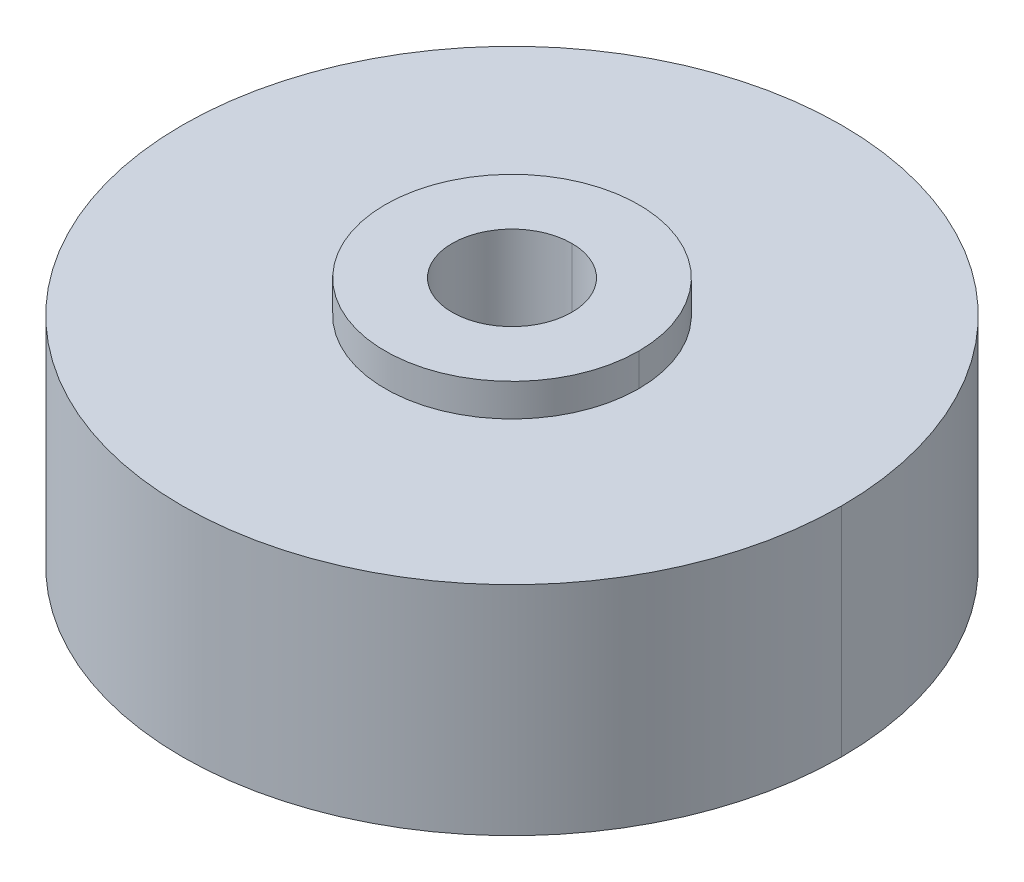
ISO-10303-21;
HEADER;
FILE_DESCRIPTION(('STEP AP214'),'2;1');
FILE_NAME('part.step','',(''),(''),'','','');
FILE_SCHEMA(('AUTOMOTIVE_DESIGN { 1 0 10303 214 1 1 1 1 }'));
ENDSEC;
DATA;
#1=APPLICATION_CONTEXT('core data for automotive mechanical design processes');
#2=APPLICATION_PROTOCOL_DEFINITION('international standard','automotive_design',2000,#1);
#3=PRODUCT_CONTEXT('',#1,'mechanical');
#4=PRODUCT('Part','Part','',(#3));
#5=PRODUCT_RELATED_PRODUCT_CATEGORY('part','',(#4));
#6=PRODUCT_DEFINITION_FORMATION('','',#4);
#7=PRODUCT_DEFINITION_CONTEXT('part definition',#1,'design');
#8=PRODUCT_DEFINITION('design','',#6,#7);
#9=PRODUCT_DEFINITION_SHAPE('','',#8);
#10=(LENGTH_UNIT() NAMED_UNIT(*) SI_UNIT(.MILLI.,.METRE.));
#11=(NAMED_UNIT(*) PLANE_ANGLE_UNIT() SI_UNIT($,.RADIAN.));
#12=(NAMED_UNIT(*) SI_UNIT($,.STERADIAN.) SOLID_ANGLE_UNIT());
#13=UNCERTAINTY_MEASURE_WITH_UNIT(LENGTH_MEASURE(1.E-05),#10,'distance_accuracy_value','');
#14=(GEOMETRIC_REPRESENTATION_CONTEXT(3) GLOBAL_UNCERTAINTY_ASSIGNED_CONTEXT((#13)) GLOBAL_UNIT_ASSIGNED_CONTEXT((#10,
#11,#12)) REPRESENTATION_CONTEXT('',''));
#15=CARTESIAN_POINT('',(0.,0.,0.));
#16=DIRECTION('',(0.,0.,1.));
#17=DIRECTION('',(1.,0.,0.));
#18=AXIS2_PLACEMENT_3D('',#15,#16,#17);
#19=CARTESIAN_POINT('',(0.,3.,0.));
#20=DIRECTION('',(0.,-1.,0.));
#21=DIRECTION('',(1.,0.,0.));
#22=AXIS2_PLACEMENT_3D('',#19,#20,#21);
#23=CYLINDRICAL_SURFACE('',#22,6.5);
#24=CARTESIAN_POINT('',(0.,3.,0.));
#25=DIRECTION('',(0.,-1.,0.));
#26=DIRECTION('',(1.,0.,0.));
#27=AXIS2_PLACEMENT_3D('',#24,#25,#26);
#28=CIRCLE('',#27,6.5);
#29=CARTESIAN_POINT('',(6.5,3.,0.));
#30=VERTEX_POINT('',#29);
#31=CARTESIAN_POINT('',(-6.5,3.,0.));
#32=VERTEX_POINT('',#31);
#33=EDGE_CURVE('E11',#30,#32,#28,.T.);
#34=ORIENTED_EDGE('',*,*,#33,.T.);
#35=DIRECTION('',(0.,-1.,0.));
#36=VECTOR('',#35,1.);
#37=CARTESIAN_POINT('',(-6.5,3.,0.));
#38=LINE('',#37,#36);
#39=CARTESIAN_POINT('',(-6.5,0.,0.));
#40=VERTEX_POINT('',#39);
#41=EDGE_CURVE('E28',#32,#40,#38,.T.);
#42=ORIENTED_EDGE('',*,*,#41,.T.);
#43=CARTESIAN_POINT('',(0.,0.,0.));
#44=DIRECTION('',(0.,-1.,0.));
#45=DIRECTION('',(1.,0.,0.));
#46=AXIS2_PLACEMENT_3D('',#43,#44,#45);
#47=CIRCLE('',#46,6.5);
#48=CARTESIAN_POINT('',(6.5,0.,0.));
#49=VERTEX_POINT('',#48);
#50=EDGE_CURVE('E230',#49,#40,#47,.T.);
#51=ORIENTED_EDGE('',*,*,#50,.F.);
#52=DIRECTION('',(0.,-1.,0.));
#53=VECTOR('',#52,1.);
#54=CARTESIAN_POINT('',(6.5,3.,0.));
#55=LINE('',#54,#53);
#56=EDGE_CURVE('E241',#30,#49,#55,.T.);
#57=ORIENTED_EDGE('',*,*,#56,.F.);
#58=EDGE_LOOP('',(#34,#42,#51,#57));
#59=FACE_BOUND('',#58,.T.);
#60=ADVANCED_FACE('F17',(#59),#23,.T.);
#61=CARTESIAN_POINT('',(0.,3.,0.));
#62=DIRECTION('',(0.,-1.,0.));
#63=DIRECTION('',(1.,0.,0.));
#64=AXIS2_PLACEMENT_3D('',#61,#62,#63);
#65=CYLINDRICAL_SURFACE('',#64,7.);
#66=CARTESIAN_POINT('',(0.,3.,0.));
#67=DIRECTION('',(0.,-1.,0.));
#68=DIRECTION('',(1.,0.,0.));
#69=AXIS2_PLACEMENT_3D('',#66,#67,#68);
#70=CIRCLE('',#69,7.);
#71=CARTESIAN_POINT('',(-7.,3.,0.));
#72=VERTEX_POINT('',#71);
#73=CARTESIAN_POINT('',(7.,3.,0.));
#74=VERTEX_POINT('',#73);
#75=EDGE_CURVE('E151',#72,#74,#70,.T.);
#76=ORIENTED_EDGE('',*,*,#75,.F.);
#77=DIRECTION('',(0.,-1.,0.));
#78=VECTOR('',#77,1.);
#79=CARTESIAN_POINT('',(-7.,3.,0.));
#80=LINE('',#79,#78);
#81=CARTESIAN_POINT('',(-7.,0.,0.));
#82=VERTEX_POINT('',#81);
#83=EDGE_CURVE('E138',#72,#82,#80,.T.);
#84=ORIENTED_EDGE('',*,*,#83,.T.);
#85=CARTESIAN_POINT('',(0.,0.,0.));
#86=DIRECTION('',(0.,-1.,0.));
#87=DIRECTION('',(1.,0.,0.));
#88=AXIS2_PLACEMENT_3D('',#85,#86,#87);
#89=CIRCLE('',#88,7.);
#90=CARTESIAN_POINT('',(7.,0.,0.));
#91=VERTEX_POINT('',#90);
#92=EDGE_CURVE('E136',#82,#91,#89,.T.);
#93=ORIENTED_EDGE('',*,*,#92,.T.);
#94=DIRECTION('',(0.,-1.,0.));
#95=VECTOR('',#94,1.);
#96=CARTESIAN_POINT('',(7.,3.,0.));
#97=LINE('',#96,#95);
#98=EDGE_CURVE('E123',#74,#91,#97,.T.);
#99=ORIENTED_EDGE('',*,*,#98,.F.);
#100=EDGE_LOOP('',(#76,#84,#93,#99));
#101=FACE_BOUND('',#100,.T.);
#102=ADVANCED_FACE('F137',(#101),#65,.F.);
#103=CARTESIAN_POINT('',(0.,6.9,0.));
#104=DIRECTION('',(0.,1.,0.));
#105=DIRECTION('',(0.,0.,1.));
#106=AXIS2_PLACEMENT_3D('',#103,#104,#105);
#107=CYLINDRICAL_SURFACE('',#106,1.65);
#108=CARTESIAN_POINT('',(0.,2.9,0.));
#109=DIRECTION('',(0.,1.,0.));
#110=DIRECTION('',(0.,0.,1.));
#111=AXIS2_PLACEMENT_3D('',#108,#109,#110);
#112=CIRCLE('',#111,1.65);
#113=CARTESIAN_POINT('',(0.,2.9,-1.65));
#114=VERTEX_POINT('',#113);
#115=CARTESIAN_POINT('',(0.,2.9,1.65));
#116=VERTEX_POINT('',#115);
#117=EDGE_CURVE('E157',#114,#116,#112,.T.);
#118=ORIENTED_EDGE('',*,*,#117,.F.);
#119=DIRECTION('',(0.,1.,0.));
#120=VECTOR('',#119,1.);
#121=CARTESIAN_POINT('',(0.,6.9,-1.65));
#122=LINE('',#121,#120);
#123=CARTESIAN_POINT('',(0.,6.9,-1.65));
#124=VERTEX_POINT('',#123);
#125=EDGE_CURVE('E141',#114,#124,#122,.T.);
#126=ORIENTED_EDGE('',*,*,#125,.T.);
#127=CARTESIAN_POINT('',(0.,6.9,0.));
#128=DIRECTION('',(0.,1.,0.));
#129=DIRECTION('',(0.,0.,1.));
#130=AXIS2_PLACEMENT_3D('',#127,#128,#129);
#131=CIRCLE('',#130,1.65);
#132=CARTESIAN_POINT('',(0.,6.9,1.65));
#133=VERTEX_POINT('',#132);
#134=EDGE_CURVE('E219',#124,#133,#131,.T.);
#135=ORIENTED_EDGE('',*,*,#134,.T.);
#136=DIRECTION('',(0.,1.,0.));
#137=VECTOR('',#136,1.);
#138=CARTESIAN_POINT('',(0.,6.9,1.65));
#139=LINE('',#138,#137);
#140=EDGE_CURVE('E163',#116,#133,#139,.T.);
#141=ORIENTED_EDGE('',*,*,#140,.F.);
#142=EDGE_LOOP('',(#118,#126,#135,#141));
#143=FACE_BOUND('',#142,.T.);
#144=ADVANCED_FACE('F281',(#143),#107,.F.);
#145=CARTESIAN_POINT('',(0.,2.9,0.));
#146=DIRECTION('',(0.,1.,0.));
#147=DIRECTION('',(0.,0.,1.));
#148=AXIS2_PLACEMENT_3D('',#145,#146,#147);
#149=CONICAL_SURFACE('',#148,1.65,1.02974425867665);
#150=DIRECTION('',(0.,0.515038074910055,0.857167300702112));
#151=VECTOR('',#150,1.);
#152=CARTESIAN_POINT('',(0.,2.9,1.65));
#153=LINE('',#152,#151);
#154=CARTESIAN_POINT('',(0.,1.90857997860452,0.));
#155=VERTEX_POINT('',#154);
#156=EDGE_CURVE('E184',#155,#116,#153,.T.);
#157=ORIENTED_EDGE('',*,*,#156,.F.);
#158=DIRECTION('',(0.,0.515038074910055,-0.857167300702112));
#159=VECTOR('',#158,1.);
#160=CARTESIAN_POINT('',(0.,2.9,-1.65));
#161=LINE('',#160,#159);
#162=EDGE_CURVE('E161',#155,#114,#161,.T.);
#163=ORIENTED_EDGE('',*,*,#162,.T.);
#164=ORIENTED_EDGE('',*,*,#117,.T.);
#165=EDGE_LOOP('',(#157,#163,#164));
#166=FACE_BOUND('',#165,.T.);
#167=ADVANCED_FACE('F289',(#166),#149,.F.);
#168=CARTESIAN_POINT('',(0.,6.9,0.));
#169=DIRECTION('',(0.,1.,0.));
#170=DIRECTION('',(-1.,0.,0.));
#171=AXIS2_PLACEMENT_3D('',#168,#169,#170);
#172=CYLINDRICAL_SURFACE('',#171,3.5);
#173=CARTESIAN_POINT('',(0.,6.,0.));
#174=DIRECTION('',(0.,1.,0.));
#175=DIRECTION('',(-1.,0.,0.));
#176=AXIS2_PLACEMENT_3D('',#173,#174,#175);
#177=CIRCLE('',#176,3.5);
#178=CARTESIAN_POINT('',(-3.5,6.,0.));
#179=VERTEX_POINT('',#178);
#180=CARTESIAN_POINT('',(3.5,6.,0.));
#181=VERTEX_POINT('',#180);
#182=EDGE_CURVE('E162',#179,#181,#177,.T.);
#183=ORIENTED_EDGE('',*,*,#182,.T.);
#184=DIRECTION('',(0.,1.,0.));
#185=VECTOR('',#184,1.);
#186=CARTESIAN_POINT('',(3.5,6.9,0.));
#187=LINE('',#186,#185);
#188=CARTESIAN_POINT('',(3.5,6.9,0.));
#189=VERTEX_POINT('',#188);
#190=EDGE_CURVE('E216',#181,#189,#187,.T.);
#191=ORIENTED_EDGE('',*,*,#190,.T.);
#192=CARTESIAN_POINT('',(0.,6.9,0.));
#193=DIRECTION('',(0.,1.,0.));
#194=DIRECTION('',(-1.,0.,0.));
#195=AXIS2_PLACEMENT_3D('',#192,#193,#194);
#196=CIRCLE('',#195,3.5);
#197=CARTESIAN_POINT('',(-3.5,6.9,0.));
#198=VERTEX_POINT('',#197);
#199=EDGE_CURVE('E155',#198,#189,#196,.T.);
#200=ORIENTED_EDGE('',*,*,#199,.F.);
#201=DIRECTION('',(0.,1.,0.));
#202=VECTOR('',#201,1.);
#203=CARTESIAN_POINT('',(-3.5,6.9,0.));
#204=LINE('',#203,#202);
#205=EDGE_CURVE('E166',#179,#198,#204,.T.);
#206=ORIENTED_EDGE('',*,*,#205,.F.);
#207=EDGE_LOOP('',(#183,#191,#200,#206));
#208=FACE_BOUND('',#207,.T.);
#209=ADVANCED_FACE('F291',(#208),#172,.T.);
#210=CARTESIAN_POINT('',(0.,6.9,0.));
#211=DIRECTION('',(0.,1.,0.));
#212=DIRECTION('',(-1.,0.,0.));
#213=AXIS2_PLACEMENT_3D('',#210,#211,#212);
#214=CYLINDRICAL_SURFACE('',#213,9.1);
#215=CARTESIAN_POINT('',(0.,0.,0.));
#216=DIRECTION('',(0.,1.,0.));
#217=DIRECTION('',(-1.,0.,0.));
#218=AXIS2_PLACEMENT_3D('',#215,#216,#217);
#219=CIRCLE('',#218,9.1);
#220=CARTESIAN_POINT('',(-9.1,0.,0.));
#221=VERTEX_POINT('',#220);
#222=CARTESIAN_POINT('',(9.1,0.,0.));
#223=VERTEX_POINT('',#222);
#224=EDGE_CURVE('E212',#221,#223,#219,.T.);
#225=ORIENTED_EDGE('',*,*,#224,.T.);
#226=DIRECTION('',(0.,1.,0.));
#227=VECTOR('',#226,1.);
#228=CARTESIAN_POINT('',(9.1,6.9,0.));
#229=LINE('',#228,#227);
#230=CARTESIAN_POINT('',(9.1,6.,0.));
#231=VERTEX_POINT('',#230);
#232=EDGE_CURVE('E211',#223,#231,#229,.T.);
#233=ORIENTED_EDGE('',*,*,#232,.T.);
#234=CARTESIAN_POINT('',(0.,6.,0.));
#235=DIRECTION('',(0.,1.,0.));
#236=DIRECTION('',(-1.,0.,0.));
#237=AXIS2_PLACEMENT_3D('',#234,#235,#236);
#238=CIRCLE('',#237,9.1);
#239=CARTESIAN_POINT('',(-9.1,6.,0.));
#240=VERTEX_POINT('',#239);
#241=EDGE_CURVE('E207',#240,#231,#238,.T.);
#242=ORIENTED_EDGE('',*,*,#241,.F.);
#243=DIRECTION('',(0.,1.,0.));
#244=VECTOR('',#243,1.);
#245=CARTESIAN_POINT('',(-9.1,6.9,0.));
#246=LINE('',#245,#244);
#247=EDGE_CURVE('E203',#221,#240,#246,.T.);
#248=ORIENTED_EDGE('',*,*,#247,.F.);
#249=EDGE_LOOP('',(#225,#233,#242,#248));
#250=FACE_BOUND('',#249,.T.);
#251=ADVANCED_FACE('F261',(#250),#214,.T.);
#252=CARTESIAN_POINT('',(0.,0.,0.));
#253=DIRECTION('',(0.,1.,0.));
#254=DIRECTION('',(1.,0.,0.));
#255=AXIS2_PLACEMENT_3D('',#252,#253,#254);
#256=PLANE('',#255);
#257=ORIENTED_EDGE('',*,*,#224,.F.);
#258=CARTESIAN_POINT('',(0.,0.,0.));
#259=DIRECTION('',(0.,1.,0.));
#260=DIRECTION('',(-1.,0.,0.));
#261=AXIS2_PLACEMENT_3D('',#258,#259,#260);
#262=CIRCLE('',#261,9.1);
#263=EDGE_CURVE('E206',#223,#221,#262,.T.);
#264=ORIENTED_EDGE('',*,*,#263,.F.);
#265=EDGE_LOOP('',(#257,#264));
#266=FACE_BOUND('',#265,.T.);
#267=CARTESIAN_POINT('',(0.,0.,0.));
#268=DIRECTION('',(0.,-1.,0.));
#269=DIRECTION('',(1.,0.,0.));
#270=AXIS2_PLACEMENT_3D('',#267,#268,#269);
#271=CIRCLE('',#270,7.);
#272=EDGE_CURVE('E128',#91,#82,#271,.T.);
#273=ORIENTED_EDGE('',*,*,#272,.F.);
#274=ORIENTED_EDGE('',*,*,#92,.F.);
#275=EDGE_LOOP('',(#273,#274));
#276=FACE_BOUND('',#275,.T.);
#277=ADVANCED_FACE('F143',(#266,#276),#256,.F.);
#278=CARTESIAN_POINT('',(0.,6.9,0.));
#279=DIRECTION('',(0.,1.,0.));
#280=DIRECTION('',(-1.,0.,0.));
#281=AXIS2_PLACEMENT_3D('',#278,#279,#280);
#282=CYLINDRICAL_SURFACE('',#281,9.1);
#283=ORIENTED_EDGE('',*,*,#232,.F.);
#284=ORIENTED_EDGE('',*,*,#263,.T.);
#285=ORIENTED_EDGE('',*,*,#247,.T.);
#286=CARTESIAN_POINT('',(0.,6.,0.));
#287=DIRECTION('',(0.,1.,0.));
#288=DIRECTION('',(-1.,0.,0.));
#289=AXIS2_PLACEMENT_3D('',#286,#287,#288);
#290=CIRCLE('',#289,9.1);
#291=EDGE_CURVE('E178',#231,#240,#290,.T.);
#292=ORIENTED_EDGE('',*,*,#291,.F.);
#293=EDGE_LOOP('',(#283,#284,#285,#292));
#294=FACE_BOUND('',#293,.T.);
#295=ADVANCED_FACE('F266',(#294),#282,.T.);
#296=CARTESIAN_POINT('',(9.1,6.,0.));
#297=DIRECTION('',(0.,-1.,0.));
#298=DIRECTION('',(0.,0.,-1.));
#299=AXIS2_PLACEMENT_3D('',#296,#297,#298);
#300=PLANE('',#299);
#301=ORIENTED_EDGE('',*,*,#241,.T.);
#302=ORIENTED_EDGE('',*,*,#291,.T.);
#303=EDGE_LOOP('',(#301,#302));
#304=FACE_BOUND('',#303,.T.);
#305=ORIENTED_EDGE('',*,*,#182,.F.);
#306=CARTESIAN_POINT('',(0.,6.,0.));
#307=DIRECTION('',(0.,1.,0.));
#308=DIRECTION('',(-1.,0.,0.));
#309=AXIS2_PLACEMENT_3D('',#306,#307,#308);
#310=CIRCLE('',#309,3.5);
#311=EDGE_CURVE('E169',#181,#179,#310,.T.);
#312=ORIENTED_EDGE('',*,*,#311,.F.);
#313=EDGE_LOOP('',(#305,#312));
#314=FACE_BOUND('',#313,.T.);
#315=ADVANCED_FACE('F311',(#304,#314),#300,.F.);
#316=CARTESIAN_POINT('',(0.,6.9,0.));
#317=DIRECTION('',(0.,1.,0.));
#318=DIRECTION('',(-1.,0.,0.));
#319=AXIS2_PLACEMENT_3D('',#316,#317,#318);
#320=CYLINDRICAL_SURFACE('',#319,3.5);
#321=ORIENTED_EDGE('',*,*,#190,.F.);
#322=ORIENTED_EDGE('',*,*,#311,.T.);
#323=ORIENTED_EDGE('',*,*,#205,.T.);
#324=CARTESIAN_POINT('',(0.,6.9,0.));
#325=DIRECTION('',(0.,1.,0.));
#326=DIRECTION('',(-1.,0.,0.));
#327=AXIS2_PLACEMENT_3D('',#324,#325,#326);
#328=CIRCLE('',#327,3.5);
#329=EDGE_CURVE('E21',#189,#198,#328,.T.);
#330=ORIENTED_EDGE('',*,*,#329,.F.);
#331=EDGE_LOOP('',(#321,#322,#323,#330));
#332=FACE_BOUND('',#331,.T.);
#333=ADVANCED_FACE('F314',(#332),#320,.T.);
#334=CARTESIAN_POINT('',(3.5,6.9,0.));
#335=DIRECTION('',(0.,-1.,0.));
#336=DIRECTION('',(0.,0.,-1.));
#337=AXIS2_PLACEMENT_3D('',#334,#335,#336);
#338=PLANE('',#337);
#339=ORIENTED_EDGE('',*,*,#199,.T.);
#340=ORIENTED_EDGE('',*,*,#329,.T.);
#341=EDGE_LOOP('',(#339,#340));
#342=FACE_BOUND('',#341,.T.);
#343=CARTESIAN_POINT('',(0.,6.9,0.));
#344=DIRECTION('',(0.,1.,0.));
#345=DIRECTION('',(0.,0.,1.));
#346=AXIS2_PLACEMENT_3D('',#343,#344,#345);
#347=CIRCLE('',#346,1.65);
#348=EDGE_CURVE('E133',#133,#124,#347,.T.);
#349=ORIENTED_EDGE('',*,*,#348,.F.);
#350=ORIENTED_EDGE('',*,*,#134,.F.);
#351=EDGE_LOOP('',(#349,#350));
#352=FACE_BOUND('',#351,.T.);
#353=ADVANCED_FACE('F284',(#342,#352),#338,.F.);
#354=CARTESIAN_POINT('',(0.,2.9,0.));
#355=DIRECTION('',(0.,1.,0.));
#356=DIRECTION('',(0.,0.,1.));
#357=AXIS2_PLACEMENT_3D('',#354,#355,#356);
#358=CONICAL_SURFACE('',#357,1.65,1.02974425867665);
#359=ORIENTED_EDGE('',*,*,#162,.F.);
#360=ORIENTED_EDGE('',*,*,#156,.T.);
#361=CARTESIAN_POINT('',(0.,2.9,0.));
#362=DIRECTION('',(0.,1.,0.));
#363=DIRECTION('',(0.,0.,1.));
#364=AXIS2_PLACEMENT_3D('',#361,#362,#363);
#365=CIRCLE('',#364,1.65);
#366=EDGE_CURVE('E165',#116,#114,#365,.T.);
#367=ORIENTED_EDGE('',*,*,#366,.T.);
#368=EDGE_LOOP('',(#359,#360,#367));
#369=FACE_BOUND('',#368,.T.);
#370=ADVANCED_FACE('F287',(#369),#358,.F.);
#371=CARTESIAN_POINT('',(0.,6.9,0.));
#372=DIRECTION('',(0.,1.,0.));
#373=DIRECTION('',(0.,0.,1.));
#374=AXIS2_PLACEMENT_3D('',#371,#372,#373);
#375=CYLINDRICAL_SURFACE('',#374,1.65);
#376=ORIENTED_EDGE('',*,*,#125,.F.);
#377=ORIENTED_EDGE('',*,*,#366,.F.);
#378=ORIENTED_EDGE('',*,*,#140,.T.);
#379=ORIENTED_EDGE('',*,*,#348,.T.);
#380=EDGE_LOOP('',(#376,#377,#378,#379));
#381=FACE_BOUND('',#380,.T.);
#382=ADVANCED_FACE('F19',(#381),#375,.F.);
#383=CARTESIAN_POINT('',(0.,3.,0.));
#384=DIRECTION('',(0.,-1.,0.));
#385=DIRECTION('',(1.,0.,0.));
#386=AXIS2_PLACEMENT_3D('',#383,#384,#385);
#387=CYLINDRICAL_SURFACE('',#386,7.);
#388=ORIENTED_EDGE('',*,*,#83,.F.);
#389=CARTESIAN_POINT('',(0.,3.,0.));
#390=DIRECTION('',(0.,-1.,0.));
#391=DIRECTION('',(1.,0.,0.));
#392=AXIS2_PLACEMENT_3D('',#389,#390,#391);
#393=CIRCLE('',#392,7.);
#394=EDGE_CURVE('E130',#74,#72,#393,.T.);
#395=ORIENTED_EDGE('',*,*,#394,.F.);
#396=ORIENTED_EDGE('',*,*,#98,.T.);
#397=ORIENTED_EDGE('',*,*,#272,.T.);
#398=EDGE_LOOP('',(#388,#395,#396,#397));
#399=FACE_BOUND('',#398,.T.);
#400=ADVANCED_FACE('F126',(#399),#387,.F.);
#401=CARTESIAN_POINT('',(0.,3.,0.));
#402=DIRECTION('',(0.,-1.,0.));
#403=DIRECTION('',(0.,0.,-1.));
#404=AXIS2_PLACEMENT_3D('',#401,#402,#403);
#405=PLANE('',#404);
#406=ORIENTED_EDGE('',*,*,#394,.T.);
#407=ORIENTED_EDGE('',*,*,#75,.T.);
#408=EDGE_LOOP('',(#406,#407));
#409=FACE_BOUND('',#408,.T.);
#410=ORIENTED_EDGE('',*,*,#33,.F.);
#411=CARTESIAN_POINT('',(0.,3.,0.));
#412=DIRECTION('',(0.,-1.,0.));
#413=DIRECTION('',(1.,0.,0.));
#414=AXIS2_PLACEMENT_3D('',#411,#412,#413);
#415=CIRCLE('',#414,6.5);
#416=EDGE_CURVE('E239',#32,#30,#415,.T.);
#417=ORIENTED_EDGE('',*,*,#416,.F.);
#418=EDGE_LOOP('',(#410,#417));
#419=FACE_BOUND('',#418,.T.);
#420=ADVANCED_FACE('F333',(#409,#419),#405,.T.);
#421=CARTESIAN_POINT('',(0.,3.,0.));
#422=DIRECTION('',(0.,-1.,0.));
#423=DIRECTION('',(1.,0.,0.));
#424=AXIS2_PLACEMENT_3D('',#421,#422,#423);
#425=CYLINDRICAL_SURFACE('',#424,6.5);
#426=ORIENTED_EDGE('',*,*,#41,.F.);
#427=ORIENTED_EDGE('',*,*,#416,.T.);
#428=ORIENTED_EDGE('',*,*,#56,.T.);
#429=CARTESIAN_POINT('',(0.,0.,0.));
#430=DIRECTION('',(0.,-1.,0.));
#431=DIRECTION('',(1.,0.,0.));
#432=AXIS2_PLACEMENT_3D('',#429,#430,#431);
#433=CIRCLE('',#432,6.5);
#434=EDGE_CURVE('E226',#40,#49,#433,.T.);
#435=ORIENTED_EDGE('',*,*,#434,.F.);
#436=EDGE_LOOP('',(#426,#427,#428,#435));
#437=FACE_BOUND('',#436,.T.);
#438=ADVANCED_FACE('F323',(#437),#425,.T.);
#439=CARTESIAN_POINT('',(0.,0.,0.));
#440=DIRECTION('',(0.,1.,0.));
#441=DIRECTION('',(1.,0.,0.));
#442=AXIS2_PLACEMENT_3D('',#439,#440,#441);
#443=PLANE('',#442);
#444=ORIENTED_EDGE('',*,*,#50,.T.);
#445=ORIENTED_EDGE('',*,*,#434,.T.);
#446=EDGE_LOOP('',(#444,#445));
#447=FACE_BOUND('',#446,.T.);
#448=ADVANCED_FACE('F320',(#447),#443,.F.);
#449=CLOSED_SHELL('',(#60,#102,#144,#167,#209,#251,#277,#295,#315,#333,#353,#370,#382,#400,#420,
#438,#448));
#450=MANIFOLD_SOLID_BREP('B1',#449);
#451=ADVANCED_BREP_SHAPE_REPRESENTATION('',(#18,#450),#14);
#452=SHAPE_DEFINITION_REPRESENTATION(#9,#451);
ENDSEC;
END-ISO-10303-21;
